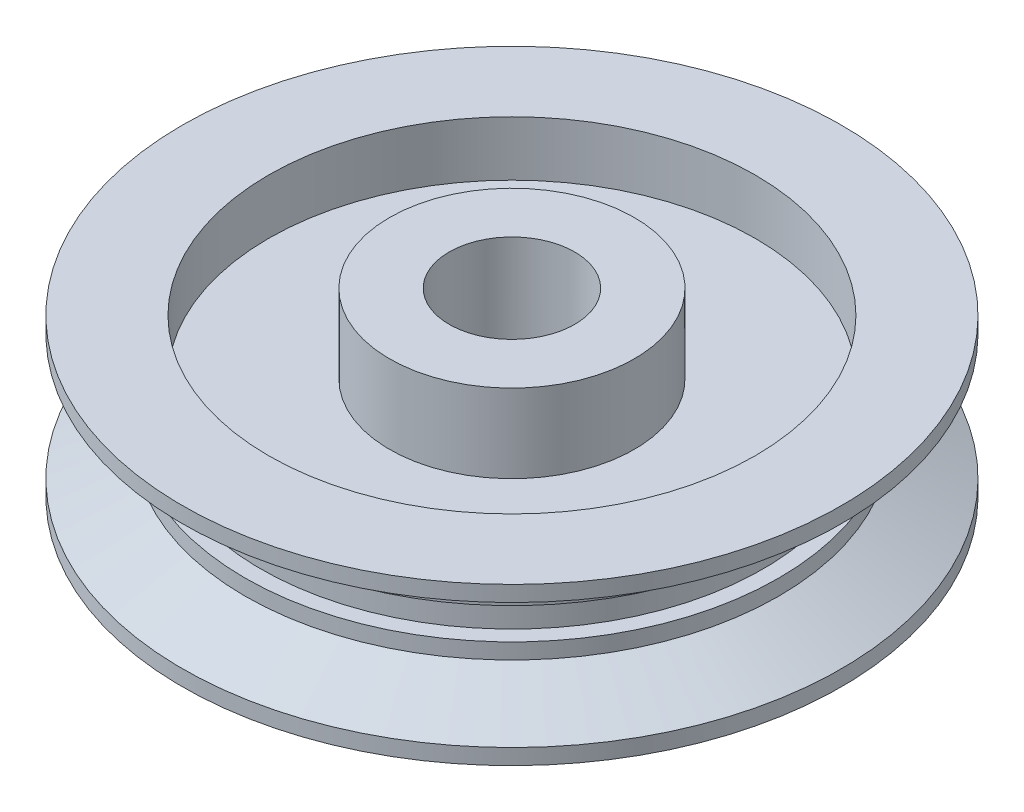
ISO-10303-21;
HEADER;
FILE_DESCRIPTION(('STEP AP214'),'2;1');
FILE_NAME('part.step','',(''),(''),'','','');
FILE_SCHEMA(('AUTOMOTIVE_DESIGN { 1 0 10303 214 1 1 1 1 }'));
ENDSEC;
DATA;
#1=APPLICATION_CONTEXT('core data for automotive mechanical design processes');
#2=APPLICATION_PROTOCOL_DEFINITION('international standard','automotive_design',2000,#1);
#3=PRODUCT_CONTEXT('',#1,'mechanical');
#4=PRODUCT('Part','Part','',(#3));
#5=PRODUCT_RELATED_PRODUCT_CATEGORY('part','',(#4));
#6=PRODUCT_DEFINITION_FORMATION('','',#4);
#7=PRODUCT_DEFINITION_CONTEXT('part definition',#1,'design');
#8=PRODUCT_DEFINITION('design','',#6,#7);
#9=PRODUCT_DEFINITION_SHAPE('','',#8);
#10=(LENGTH_UNIT() NAMED_UNIT(*) SI_UNIT(.MILLI.,.METRE.));
#11=(NAMED_UNIT(*) PLANE_ANGLE_UNIT() SI_UNIT($,.RADIAN.));
#12=(NAMED_UNIT(*) SI_UNIT($,.STERADIAN.) SOLID_ANGLE_UNIT());
#13=UNCERTAINTY_MEASURE_WITH_UNIT(LENGTH_MEASURE(1.E-05),#10,'distance_accuracy_value','');
#14=(GEOMETRIC_REPRESENTATION_CONTEXT(3) GLOBAL_UNCERTAINTY_ASSIGNED_CONTEXT((#13)) GLOBAL_UNIT_ASSIGNED_CONTEXT((#10,
#11,#12)) REPRESENTATION_CONTEXT('',''));
#15=CARTESIAN_POINT('',(0.,0.,0.));
#16=DIRECTION('',(0.,0.,1.));
#17=DIRECTION('',(1.,0.,0.));
#18=AXIS2_PLACEMENT_3D('',#15,#16,#17);
#19=CARTESIAN_POINT('',(-10.5,-2.5,0.));
#20=DIRECTION('',(0.,-1.,0.));
#21=DIRECTION('',(-1.,0.,0.));
#22=AXIS2_PLACEMENT_3D('',#19,#20,#21);
#23=PLANE('',#22);
#24=CARTESIAN_POINT('',(0.,-2.5,0.));
#25=DIRECTION('',(0.,1.,0.));
#26=DIRECTION('',(-1.,0.,0.));
#27=AXIS2_PLACEMENT_3D('',#24,#25,#26);
#28=CIRCLE('',#27,10.5);
#29=CARTESIAN_POINT('',(-10.5,-2.5,0.));
#30=VERTEX_POINT('',#29);
#31=EDGE_CURVE('E70',#30,#30,#28,.T.);
#32=ORIENTED_EDGE('',*,*,#31,.F.);
#33=EDGE_LOOP('',(#32));
#34=FACE_BOUND('',#33,.T.);
#35=CARTESIAN_POINT('',(0.,-2.5,0.));
#36=DIRECTION('',(0.,1.,0.));
#37=DIRECTION('',(-1.,0.,0.));
#38=AXIS2_PLACEMENT_3D('',#35,#36,#37);
#39=CIRCLE('',#38,7.75);
#40=CARTESIAN_POINT('',(-7.75,-2.5,0.));
#41=VERTEX_POINT('',#40);
#42=EDGE_CURVE('E86',#41,#41,#39,.T.);
#43=ORIENTED_EDGE('',*,*,#42,.T.);
#44=EDGE_LOOP('',(#43));
#45=FACE_BOUND('',#44,.T.);
#46=ADVANCED_FACE('F32',(#34,#45),#23,.T.);
#47=CARTESIAN_POINT('',(0.,0.749999999999999,0.));
#48=DIRECTION('',(0.,1.,0.));
#49=DIRECTION('',(-1.,0.,0.));
#50=AXIS2_PLACEMENT_3D('',#47,#48,#49);
#51=PLANE('',#50);
#52=CARTESIAN_POINT('',(0.,0.749999999999999,0.));
#53=DIRECTION('',(0.,1.,0.));
#54=DIRECTION('',(-1.,0.,0.));
#55=AXIS2_PLACEMENT_3D('',#52,#53,#54);
#56=CIRCLE('',#55,7.75);
#57=CARTESIAN_POINT('',(-7.75,0.75,0.));
#58=VERTEX_POINT('',#57);
#59=EDGE_CURVE('E73',#58,#58,#56,.T.);
#60=ORIENTED_EDGE('',*,*,#59,.T.);
#61=EDGE_LOOP('',(#60));
#62=FACE_BOUND('',#61,.T.);
#63=CARTESIAN_POINT('',(0.,0.749999999999999,0.));
#64=DIRECTION('',(0.,1.,0.));
#65=DIRECTION('',(-1.,0.,0.));
#66=AXIS2_PLACEMENT_3D('',#63,#64,#65);
#67=CIRCLE('',#66,3.9);
#68=CARTESIAN_POINT('',(-3.9,0.75,0.));
#69=VERTEX_POINT('',#68);
#70=EDGE_CURVE('E80',#69,#69,#67,.T.);
#71=ORIENTED_EDGE('',*,*,#70,.F.);
#72=EDGE_LOOP('',(#71));
#73=FACE_BOUND('',#72,.T.);
#74=ADVANCED_FACE('F117',(#62,#73),#51,.T.);
#75=CARTESIAN_POINT('',(0.,2.5,0.));
#76=DIRECTION('',(0.,1.,0.));
#77=DIRECTION('',(-1.,0.,0.));
#78=AXIS2_PLACEMENT_3D('',#75,#76,#77);
#79=CYLINDRICAL_SURFACE('',#78,8.);
#80=CARTESIAN_POINT('',(0.,0.499999999999998,0.));
#81=DIRECTION('',(0.,1.,0.));
#82=DIRECTION('',(-1.,0.,0.));
#83=AXIS2_PLACEMENT_3D('',#80,#81,#82);
#84=CIRCLE('',#83,8.);
#85=CARTESIAN_POINT('',(-8.,0.499999999999999,0.));
#86=VERTEX_POINT('',#85);
#87=EDGE_CURVE('E39',#86,#86,#84,.T.);
#88=ORIENTED_EDGE('',*,*,#87,.F.);
#89=EDGE_LOOP('',(#88));
#90=FACE_BOUND('',#89,.T.);
#91=CARTESIAN_POINT('',(0.,-0.499999999999998,0.));
#92=DIRECTION('',(0.,1.,0.));
#93=DIRECTION('',(-1.,0.,0.));
#94=AXIS2_PLACEMENT_3D('',#91,#92,#93);
#95=CIRCLE('',#94,8.);
#96=CARTESIAN_POINT('',(-8.,-0.499999999999999,0.));
#97=VERTEX_POINT('',#96);
#98=EDGE_CURVE('E58',#97,#97,#95,.T.);
#99=ORIENTED_EDGE('',*,*,#98,.T.);
#100=EDGE_LOOP('',(#99));
#101=FACE_BOUND('',#100,.T.);
#102=ADVANCED_FACE('F34',(#90,#101),#79,.T.);
#103=CARTESIAN_POINT('',(-8.,0.499999999999999,0.));
#104=DIRECTION('',(0.,-1.,0.));
#105=DIRECTION('',(1.,0.,0.));
#106=AXIS2_PLACEMENT_3D('',#103,#104,#105);
#107=PLANE('',#106);
#108=ORIENTED_EDGE('',*,*,#87,.T.);
#109=EDGE_LOOP('',(#108));
#110=FACE_BOUND('',#109,.T.);
#111=CARTESIAN_POINT('',(0.,0.499999999999998,0.));
#112=DIRECTION('',(0.,1.,0.));
#113=DIRECTION('',(-1.,0.,0.));
#114=AXIS2_PLACEMENT_3D('',#111,#112,#113);
#115=CIRCLE('',#114,8.5);
#116=CARTESIAN_POINT('',(-8.5,0.499999999999999,0.));
#117=VERTEX_POINT('',#116);
#118=EDGE_CURVE('E43',#117,#117,#115,.T.);
#119=ORIENTED_EDGE('',*,*,#118,.F.);
#120=EDGE_LOOP('',(#119));
#121=FACE_BOUND('',#120,.T.);
#122=ADVANCED_FACE('F125',(#110,#121),#107,.T.);
#123=CARTESIAN_POINT('',(0.,2.5,0.));
#124=DIRECTION('',(0.,1.,0.));
#125=DIRECTION('',(-1.,0.,0.));
#126=AXIS2_PLACEMENT_3D('',#123,#124,#125);
#127=CYLINDRICAL_SURFACE('',#126,8.5);
#128=ORIENTED_EDGE('',*,*,#118,.T.);
#129=EDGE_LOOP('',(#128));
#130=FACE_BOUND('',#129,.T.);
#131=CARTESIAN_POINT('',(0.,0.999999999999998,0.));
#132=DIRECTION('',(0.,1.,0.));
#133=DIRECTION('',(-1.,0.,0.));
#134=AXIS2_PLACEMENT_3D('',#131,#132,#133);
#135=CIRCLE('',#134,8.5);
#136=CARTESIAN_POINT('',(-8.5,0.999999999999999,0.));
#137=VERTEX_POINT('',#136);
#138=EDGE_CURVE('E47',#137,#137,#135,.T.);
#139=ORIENTED_EDGE('',*,*,#138,.F.);
#140=EDGE_LOOP('',(#139));
#141=FACE_BOUND('',#140,.T.);
#142=ADVANCED_FACE('F160',(#130,#141),#127,.T.);
#143=CARTESIAN_POINT('',(0.,2.,0.));
#144=DIRECTION('',(0.,1.,0.));
#145=DIRECTION('',(-1.,0.,0.));
#146=AXIS2_PLACEMENT_3D('',#143,#144,#145);
#147=CONICAL_SURFACE('',#146,10.5,1.10714871779409);
#148=ORIENTED_EDGE('',*,*,#138,.T.);
#149=EDGE_LOOP('',(#148));
#150=FACE_BOUND('',#149,.T.);
#151=CARTESIAN_POINT('',(0.,2.,0.));
#152=DIRECTION('',(0.,1.,0.));
#153=DIRECTION('',(-1.,0.,0.));
#154=AXIS2_PLACEMENT_3D('',#151,#152,#153);
#155=CIRCLE('',#154,10.5);
#156=CARTESIAN_POINT('',(-10.5,2.,0.));
#157=VERTEX_POINT('',#156);
#158=EDGE_CURVE('E52',#157,#157,#155,.T.);
#159=ORIENTED_EDGE('',*,*,#158,.F.);
#160=EDGE_LOOP('',(#159));
#161=FACE_BOUND('',#160,.T.);
#162=ADVANCED_FACE('F156',(#150,#161),#147,.T.);
#163=CARTESIAN_POINT('',(0.,2.5,0.));
#164=DIRECTION('',(0.,1.,0.));
#165=DIRECTION('',(-1.,0.,0.));
#166=AXIS2_PLACEMENT_3D('',#163,#164,#165);
#167=CYLINDRICAL_SURFACE('',#166,10.5);
#168=ORIENTED_EDGE('',*,*,#158,.T.);
#169=EDGE_LOOP('',(#168));
#170=FACE_BOUND('',#169,.T.);
#171=CARTESIAN_POINT('',(0.,2.5,0.));
#172=DIRECTION('',(0.,1.,0.));
#173=DIRECTION('',(-1.,0.,0.));
#174=AXIS2_PLACEMENT_3D('',#171,#172,#173);
#175=CIRCLE('',#174,10.5);
#176=CARTESIAN_POINT('',(-10.5,2.5,0.));
#177=VERTEX_POINT('',#176);
#178=EDGE_CURVE('E55',#177,#177,#175,.T.);
#179=ORIENTED_EDGE('',*,*,#178,.F.);
#180=EDGE_LOOP('',(#179));
#181=FACE_BOUND('',#180,.T.);
#182=ADVANCED_FACE('F152',(#170,#181),#167,.T.);
#183=CARTESIAN_POINT('',(-10.5,2.5,0.));
#184=DIRECTION('',(0.,1.,0.));
#185=DIRECTION('',(-1.,0.,0.));
#186=AXIS2_PLACEMENT_3D('',#183,#184,#185);
#187=PLANE('',#186);
#188=CARTESIAN_POINT('',(0.,2.5,0.));
#189=DIRECTION('',(0.,1.,0.));
#190=DIRECTION('',(-1.,0.,0.));
#191=AXIS2_PLACEMENT_3D('',#188,#189,#190);
#192=CIRCLE('',#191,7.75);
#193=CARTESIAN_POINT('',(-7.75,2.5,0.));
#194=VERTEX_POINT('',#193);
#195=EDGE_CURVE('E74',#194,#194,#192,.T.);
#196=ORIENTED_EDGE('',*,*,#195,.F.);
#197=EDGE_LOOP('',(#196));
#198=FACE_BOUND('',#197,.T.);
#199=ORIENTED_EDGE('',*,*,#178,.T.);
#200=EDGE_LOOP('',(#199));
#201=FACE_BOUND('',#200,.T.);
#202=ADVANCED_FACE('F148',(#198,#201),#187,.T.);
#203=CARTESIAN_POINT('',(-8.,-0.499999999999999,0.));
#204=DIRECTION('',(0.,1.,0.));
#205=DIRECTION('',(1.,0.,0.));
#206=AXIS2_PLACEMENT_3D('',#203,#204,#205);
#207=PLANE('',#206);
#208=ORIENTED_EDGE('',*,*,#98,.F.);
#209=EDGE_LOOP('',(#208));
#210=FACE_BOUND('',#209,.T.);
#211=CARTESIAN_POINT('',(0.,-0.499999999999998,0.));
#212=DIRECTION('',(0.,1.,0.));
#213=DIRECTION('',(-1.,0.,0.));
#214=AXIS2_PLACEMENT_3D('',#211,#212,#213);
#215=CIRCLE('',#214,8.5);
#216=CARTESIAN_POINT('',(-8.5,-0.499999999999999,0.));
#217=VERTEX_POINT('',#216);
#218=EDGE_CURVE('E61',#217,#217,#215,.T.);
#219=ORIENTED_EDGE('',*,*,#218,.T.);
#220=EDGE_LOOP('',(#219));
#221=FACE_BOUND('',#220,.T.);
#222=ADVANCED_FACE('F144',(#210,#221),#207,.T.);
#223=CARTESIAN_POINT('',(0.,-2.5,0.));
#224=DIRECTION('',(0.,-1.,0.));
#225=DIRECTION('',(-1.,0.,0.));
#226=AXIS2_PLACEMENT_3D('',#223,#224,#225);
#227=CYLINDRICAL_SURFACE('',#226,8.5);
#228=ORIENTED_EDGE('',*,*,#218,.F.);
#229=EDGE_LOOP('',(#228));
#230=FACE_BOUND('',#229,.T.);
#231=CARTESIAN_POINT('',(0.,-0.999999999999998,0.));
#232=DIRECTION('',(0.,1.,0.));
#233=DIRECTION('',(-1.,0.,0.));
#234=AXIS2_PLACEMENT_3D('',#231,#232,#233);
#235=CIRCLE('',#234,8.5);
#236=CARTESIAN_POINT('',(-8.5,-0.999999999999999,0.));
#237=VERTEX_POINT('',#236);
#238=EDGE_CURVE('E64',#237,#237,#235,.T.);
#239=ORIENTED_EDGE('',*,*,#238,.T.);
#240=EDGE_LOOP('',(#239));
#241=FACE_BOUND('',#240,.T.);
#242=ADVANCED_FACE('F140',(#230,#241),#227,.T.);
#243=CARTESIAN_POINT('',(0.,-2.,0.));
#244=DIRECTION('',(0.,-1.,0.));
#245=DIRECTION('',(-1.,0.,0.));
#246=AXIS2_PLACEMENT_3D('',#243,#244,#245);
#247=CONICAL_SURFACE('',#246,10.5,1.10714871779409);
#248=ORIENTED_EDGE('',*,*,#238,.F.);
#249=EDGE_LOOP('',(#248));
#250=FACE_BOUND('',#249,.T.);
#251=CARTESIAN_POINT('',(0.,-2.,0.));
#252=DIRECTION('',(0.,1.,0.));
#253=DIRECTION('',(-1.,0.,0.));
#254=AXIS2_PLACEMENT_3D('',#251,#252,#253);
#255=CIRCLE('',#254,10.5);
#256=CARTESIAN_POINT('',(-10.5,-2.,0.));
#257=VERTEX_POINT('',#256);
#258=EDGE_CURVE('E67',#257,#257,#255,.T.);
#259=ORIENTED_EDGE('',*,*,#258,.T.);
#260=EDGE_LOOP('',(#259));
#261=FACE_BOUND('',#260,.T.);
#262=ADVANCED_FACE('F136',(#250,#261),#247,.T.);
#263=CARTESIAN_POINT('',(0.,-2.5,0.));
#264=DIRECTION('',(0.,-1.,0.));
#265=DIRECTION('',(-1.,0.,0.));
#266=AXIS2_PLACEMENT_3D('',#263,#264,#265);
#267=CYLINDRICAL_SURFACE('',#266,10.5);
#268=ORIENTED_EDGE('',*,*,#258,.F.);
#269=EDGE_LOOP('',(#268));
#270=FACE_BOUND('',#269,.T.);
#271=ORIENTED_EDGE('',*,*,#31,.T.);
#272=EDGE_LOOP('',(#271));
#273=FACE_BOUND('',#272,.T.);
#274=ADVANCED_FACE('F131',(#270,#273),#267,.T.);
#275=CARTESIAN_POINT('',(0.,0.749999999999999,0.));
#276=DIRECTION('',(0.,1.,0.));
#277=DIRECTION('',(-1.,0.,0.));
#278=AXIS2_PLACEMENT_3D('',#275,#276,#277);
#279=CYLINDRICAL_SURFACE('',#278,7.75);
#280=ORIENTED_EDGE('',*,*,#59,.F.);
#281=EDGE_LOOP('',(#280));
#282=FACE_BOUND('',#281,.T.);
#283=ORIENTED_EDGE('',*,*,#195,.T.);
#284=EDGE_LOOP('',(#283));
#285=FACE_BOUND('',#284,.T.);
#286=ADVANCED_FACE('F113',(#282,#285),#279,.F.);
#287=CARTESIAN_POINT('',(0.,3.25,0.));
#288=DIRECTION('',(0.,-1.,0.));
#289=DIRECTION('',(1.,0.,0.));
#290=AXIS2_PLACEMENT_3D('',#287,#288,#289);
#291=CYLINDRICAL_SURFACE('',#290,3.9);
#292=CARTESIAN_POINT('',(0.,3.25,0.));
#293=DIRECTION('',(0.,1.,0.));
#294=DIRECTION('',(-1.,0.,0.));
#295=AXIS2_PLACEMENT_3D('',#292,#293,#294);
#296=CIRCLE('',#295,3.9);
#297=CARTESIAN_POINT('',(-3.9,3.25,0.));
#298=VERTEX_POINT('',#297);
#299=EDGE_CURVE('E77',#298,#298,#296,.T.);
#300=ORIENTED_EDGE('',*,*,#299,.F.);
#301=EDGE_LOOP('',(#300));
#302=FACE_BOUND('',#301,.T.);
#303=ORIENTED_EDGE('',*,*,#70,.T.);
#304=EDGE_LOOP('',(#303));
#305=FACE_BOUND('',#304,.T.);
#306=ADVANCED_FACE('F107',(#302,#305),#291,.T.);
#307=CARTESIAN_POINT('',(0.,3.25,0.));
#308=DIRECTION('',(0.,1.,0.));
#309=DIRECTION('',(-1.,0.,0.));
#310=AXIS2_PLACEMENT_3D('',#307,#308,#309);
#311=PLANE('',#310);
#312=CARTESIAN_POINT('',(0.,3.25,0.));
#313=DIRECTION('',(0.,1.,0.));
#314=DIRECTION('',(-1.,0.,0.));
#315=AXIS2_PLACEMENT_3D('',#312,#313,#314);
#316=CIRCLE('',#315,2.);
#317=CARTESIAN_POINT('',(-2.,3.25,0.));
#318=VERTEX_POINT('',#317);
#319=EDGE_CURVE('E94',#318,#318,#316,.T.);
#320=ORIENTED_EDGE('',*,*,#319,.F.);
#321=EDGE_LOOP('',(#320));
#322=FACE_BOUND('',#321,.T.);
#323=ORIENTED_EDGE('',*,*,#299,.T.);
#324=EDGE_LOOP('',(#323));
#325=FACE_BOUND('',#324,.T.);
#326=ADVANCED_FACE('F103',(#322,#325),#311,.T.);
#327=CARTESIAN_POINT('',(0.,-0.749999999999999,0.));
#328=DIRECTION('',(0.,-1.,0.));
#329=DIRECTION('',(1.,0.,0.));
#330=AXIS2_PLACEMENT_3D('',#327,#328,#329);
#331=CYLINDRICAL_SURFACE('',#330,7.75);
#332=CARTESIAN_POINT('',(0.,-0.749999999999999,0.));
#333=DIRECTION('',(0.,1.,0.));
#334=DIRECTION('',(-1.,0.,0.));
#335=AXIS2_PLACEMENT_3D('',#332,#333,#334);
#336=CIRCLE('',#335,7.75);
#337=CARTESIAN_POINT('',(-7.75,-0.75,0.));
#338=VERTEX_POINT('',#337);
#339=EDGE_CURVE('E83',#338,#338,#336,.T.);
#340=ORIENTED_EDGE('',*,*,#339,.T.);
#341=EDGE_LOOP('',(#340));
#342=FACE_BOUND('',#341,.T.);
#343=ORIENTED_EDGE('',*,*,#42,.F.);
#344=EDGE_LOOP('',(#343));
#345=FACE_BOUND('',#344,.T.);
#346=ADVANCED_FACE('F106',(#342,#345),#331,.F.);
#347=CARTESIAN_POINT('',(0.,-0.749999999999999,0.));
#348=DIRECTION('',(0.,-1.,0.));
#349=DIRECTION('',(-1.,0.,0.));
#350=AXIS2_PLACEMENT_3D('',#347,#348,#349);
#351=PLANE('',#350);
#352=CARTESIAN_POINT('',(0.,-0.749999999999999,0.));
#353=DIRECTION('',(0.,-1.,0.));
#354=DIRECTION('',(1.,0.,0.));
#355=AXIS2_PLACEMENT_3D('',#352,#353,#354);
#356=CIRCLE('',#355,3.9);
#357=CARTESIAN_POINT('',(3.9,-0.749999999999998,0.));
#358=VERTEX_POINT('',#357);
#359=EDGE_CURVE('E10',#358,#358,#356,.T.);
#360=ORIENTED_EDGE('',*,*,#359,.F.);
#361=EDGE_LOOP('',(#360));
#362=FACE_BOUND('',#361,.T.);
#363=ORIENTED_EDGE('',*,*,#339,.F.);
#364=EDGE_LOOP('',(#363));
#365=FACE_BOUND('',#364,.T.);
#366=ADVANCED_FACE('F231',(#362,#365),#351,.T.);
#367=CARTESIAN_POINT('',(0.,-3.25,0.));
#368=DIRECTION('',(0.,1.,0.));
#369=DIRECTION('',(-1.,0.,0.));
#370=AXIS2_PLACEMENT_3D('',#367,#368,#369);
#371=CYLINDRICAL_SURFACE('',#370,3.9);
#372=CARTESIAN_POINT('',(0.,-3.25,0.));
#373=DIRECTION('',(0.,1.,0.));
#374=DIRECTION('',(-1.,0.,0.));
#375=AXIS2_PLACEMENT_3D('',#372,#373,#374);
#376=CIRCLE('',#375,3.9);
#377=CARTESIAN_POINT('',(-3.9,-3.25,0.));
#378=VERTEX_POINT('',#377);
#379=EDGE_CURVE('E89',#378,#378,#376,.T.);
#380=ORIENTED_EDGE('',*,*,#379,.T.);
#381=EDGE_LOOP('',(#380));
#382=FACE_BOUND('',#381,.T.);
#383=ORIENTED_EDGE('',*,*,#359,.T.);
#384=EDGE_LOOP('',(#383));
#385=FACE_BOUND('',#384,.T.);
#386=ADVANCED_FACE('F239',(#382,#385),#371,.T.);
#387=CARTESIAN_POINT('',(0.,-3.25,0.));
#388=DIRECTION('',(0.,-1.,0.));
#389=DIRECTION('',(-1.,0.,0.));
#390=AXIS2_PLACEMENT_3D('',#387,#388,#389);
#391=PLANE('',#390);
#392=CARTESIAN_POINT('',(0.,-3.25,0.));
#393=DIRECTION('',(0.,-1.,0.));
#394=DIRECTION('',(1.,0.,0.));
#395=AXIS2_PLACEMENT_3D('',#392,#393,#394);
#396=CIRCLE('',#395,2.);
#397=CARTESIAN_POINT('',(2.,-3.25,0.));
#398=VERTEX_POINT('',#397);
#399=EDGE_CURVE('E95',#398,#398,#396,.F.);
#400=ORIENTED_EDGE('',*,*,#399,.T.);
#401=EDGE_LOOP('',(#400));
#402=FACE_BOUND('',#401,.T.);
#403=ORIENTED_EDGE('',*,*,#379,.F.);
#404=EDGE_LOOP('',(#403));
#405=FACE_BOUND('',#404,.T.);
#406=ADVANCED_FACE('F246',(#402,#405),#391,.T.);
#407=CARTESIAN_POINT('',(0.,-3.251,0.));
#408=DIRECTION('',(0.,1.,0.));
#409=DIRECTION('',(-1.,0.,0.));
#410=AXIS2_PLACEMENT_3D('',#407,#408,#409);
#411=CYLINDRICAL_SURFACE('',#410,2.);
#412=ORIENTED_EDGE('',*,*,#399,.F.);
#413=EDGE_LOOP('',(#412));
#414=FACE_BOUND('',#413,.T.);
#415=ORIENTED_EDGE('',*,*,#319,.T.);
#416=EDGE_LOOP('',(#415));
#417=FACE_BOUND('',#416,.T.);
#418=ADVANCED_FACE('F101',(#414,#417),#411,.F.);
#419=CLOSED_SHELL('',(#46,#74,#102,#122,#142,#162,#182,#202,#222,#242,#262,#274,#286,#306,#326,
#346,#366,#386,#406,#418));
#420=MANIFOLD_SOLID_BREP('B2',#419);
#421=ADVANCED_BREP_SHAPE_REPRESENTATION('',(#18,#420),#14);
#422=SHAPE_DEFINITION_REPRESENTATION(#9,#421);
ENDSEC;
END-ISO-10303-21;
